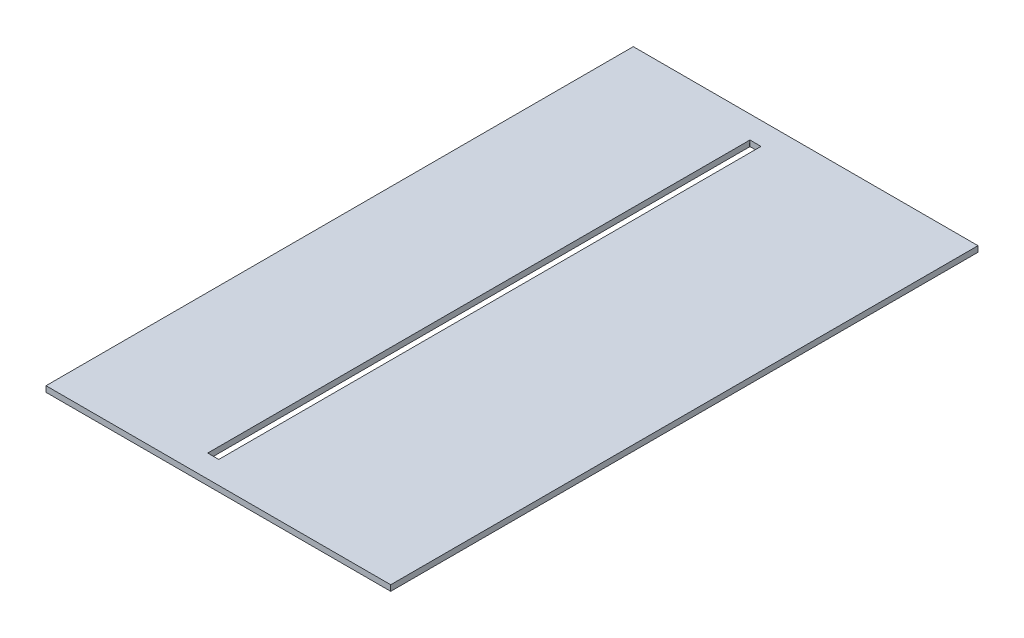
ISO-10303-21;
HEADER;
FILE_DESCRIPTION(('STEP AP214'),'2;1');
FILE_NAME('part.step','',(''),(''),'','','');
FILE_SCHEMA(('AUTOMOTIVE_DESIGN { 1 0 10303 214 1 1 1 1 }'));
ENDSEC;
DATA;
#1=APPLICATION_CONTEXT('core data for automotive mechanical design processes');
#2=APPLICATION_PROTOCOL_DEFINITION('international standard','automotive_design',2000,#1);
#3=PRODUCT_CONTEXT('',#1,'mechanical');
#4=PRODUCT('Part','Part','',(#3));
#5=PRODUCT_RELATED_PRODUCT_CATEGORY('part','',(#4));
#6=PRODUCT_DEFINITION_FORMATION('','',#4);
#7=PRODUCT_DEFINITION_CONTEXT('part definition',#1,'design');
#8=PRODUCT_DEFINITION('design','',#6,#7);
#9=PRODUCT_DEFINITION_SHAPE('','',#8);
#10=(LENGTH_UNIT() NAMED_UNIT(*) SI_UNIT(.MILLI.,.METRE.));
#11=(NAMED_UNIT(*) PLANE_ANGLE_UNIT() SI_UNIT($,.RADIAN.));
#12=(NAMED_UNIT(*) SI_UNIT($,.STERADIAN.) SOLID_ANGLE_UNIT());
#13=UNCERTAINTY_MEASURE_WITH_UNIT(LENGTH_MEASURE(1.E-05),#10,'distance_accuracy_value','');
#14=(GEOMETRIC_REPRESENTATION_CONTEXT(3) GLOBAL_UNCERTAINTY_ASSIGNED_CONTEXT((#13)) GLOBAL_UNIT_ASSIGNED_CONTEXT((#10,
#11,#12)) REPRESENTATION_CONTEXT('',''));
#15=CARTESIAN_POINT('',(0.,0.,0.));
#16=DIRECTION('',(0.,0.,1.));
#17=DIRECTION('',(1.,0.,0.));
#18=AXIS2_PLACEMENT_3D('',#15,#16,#17);
#19=CARTESIAN_POINT('',(18.6155805008028,19.8775376608099,62.7159322336888));
#20=DIRECTION('',(1.,0.,0.));
#21=DIRECTION('',(0.,1.,0.));
#22=AXIS2_PLACEMENT_3D('',#19,#20,#21);
#23=PLANE('',#22);
#24=DIRECTION('',(0.,0.,-1.));
#25=VECTOR('',#24,1.);
#26=CARTESIAN_POINT('',(18.6155805008028,20.499,62.7159322336888));
#27=LINE('',#26,#25);
#28=CARTESIAN_POINT('',(18.6155805008028,20.499,62.7159322336888));
#29=VERTEX_POINT('',#28);
#30=CARTESIAN_POINT('',(18.6155805008028,20.499,-0.715932233688751));
#31=VERTEX_POINT('',#30);
#32=EDGE_CURVE('E213',#29,#31,#27,.T.);
#33=ORIENTED_EDGE('',*,*,#32,.F.);
#34=DIRECTION('',(0.,1.,0.));
#35=VECTOR('',#34,1.);
#36=CARTESIAN_POINT('',(18.6155805008028,19.8775376608099,62.7159322336888));
#37=LINE('',#36,#35);
#38=CARTESIAN_POINT('',(18.6155805008028,19.8775376608099,62.7159322336888));
#39=VERTEX_POINT('',#38);
#40=EDGE_CURVE('E38',#39,#29,#37,.T.);
#41=ORIENTED_EDGE('',*,*,#40,.F.);
#42=DIRECTION('',(0.,0.,-1.));
#43=VECTOR('',#42,1.);
#44=CARTESIAN_POINT('',(18.6155805008028,19.8775376608099,62.7159322336888));
#45=LINE('',#44,#43);
#46=CARTESIAN_POINT('',(18.6155805008028,19.8775376608099,-0.715932233688751));
#47=VERTEX_POINT('',#46);
#48=EDGE_CURVE('E132',#39,#47,#45,.T.);
#49=ORIENTED_EDGE('',*,*,#48,.T.);
#50=DIRECTION('',(0.,1.,0.));
#51=VECTOR('',#50,1.);
#52=CARTESIAN_POINT('',(18.6155805008028,19.8775376608099,-0.715932233688751));
#53=LINE('',#52,#51);
#54=EDGE_CURVE('E10',#47,#31,#53,.T.);
#55=ORIENTED_EDGE('',*,*,#54,.T.);
#56=EDGE_LOOP('',(#33,#41,#49,#55));
#57=FACE_BOUND('',#56,.T.);
#58=ADVANCED_FACE('F16',(#57),#23,.T.);
#59=CARTESIAN_POINT('',(18.6155805008028,19.8775376608099,-0.715932233688748));
#60=DIRECTION('',(0.,0.,-1.));
#61=DIRECTION('',(-1.,0.,0.));
#62=AXIS2_PLACEMENT_3D('',#59,#60,#61);
#63=PLANE('',#62);
#64=DIRECTION('',(-1.,0.,0.));
#65=VECTOR('',#64,1.);
#66=CARTESIAN_POINT('',(18.6155805008028,20.499,-0.715932233688748));
#67=LINE('',#66,#65);
#68=CARTESIAN_POINT('',(-18.6155805008029,20.499,-0.715932233688765));
#69=VERTEX_POINT('',#68);
#70=EDGE_CURVE('E218',#31,#69,#67,.T.);
#71=ORIENTED_EDGE('',*,*,#70,.F.);
#72=ORIENTED_EDGE('',*,*,#54,.F.);
#73=DIRECTION('',(-1.,0.,0.));
#74=VECTOR('',#73,1.);
#75=CARTESIAN_POINT('',(18.6155805008028,19.8775376608099,-0.715932233688748));
#76=LINE('',#75,#74);
#77=CARTESIAN_POINT('',(-18.6155805008029,19.8775376608099,-0.715932233688765));
#78=VERTEX_POINT('',#77);
#79=EDGE_CURVE('E128',#47,#78,#76,.T.);
#80=ORIENTED_EDGE('',*,*,#79,.T.);
#81=DIRECTION('',(0.,1.,0.));
#82=VECTOR('',#81,1.);
#83=CARTESIAN_POINT('',(-18.6155805008029,19.8775376608099,-0.715932233688765));
#84=LINE('',#83,#82);
#85=EDGE_CURVE('E29',#78,#69,#84,.T.);
#86=ORIENTED_EDGE('',*,*,#85,.T.);
#87=EDGE_LOOP('',(#71,#72,#80,#86));
#88=FACE_BOUND('',#87,.T.);
#89=ADVANCED_FACE('F129',(#88),#63,.T.);
#90=CARTESIAN_POINT('',(-18.6155805008029,19.8775376608099,-0.715932233688765));
#91=DIRECTION('',(-1.,0.,0.));
#92=DIRECTION('',(0.,-1.,0.));
#93=AXIS2_PLACEMENT_3D('',#90,#91,#92);
#94=PLANE('',#93);
#95=DIRECTION('',(0.,0.,1.));
#96=VECTOR('',#95,1.);
#97=CARTESIAN_POINT('',(-18.6155805008029,20.499,-0.715932233688765));
#98=LINE('',#97,#96);
#99=CARTESIAN_POINT('',(-18.6155805008029,20.499,62.7159322336888));
#100=VERTEX_POINT('',#99);
#101=EDGE_CURVE('E122',#69,#100,#98,.T.);
#102=ORIENTED_EDGE('',*,*,#101,.F.);
#103=ORIENTED_EDGE('',*,*,#85,.F.);
#104=DIRECTION('',(0.,0.,1.));
#105=VECTOR('',#104,1.);
#106=CARTESIAN_POINT('',(-18.6155805008029,19.8775376608099,-0.715932233688765));
#107=LINE('',#106,#105);
#108=CARTESIAN_POINT('',(-18.6155805008029,19.8775376608099,62.7159322336888));
#109=VERTEX_POINT('',#108);
#110=EDGE_CURVE('E119',#78,#109,#107,.T.);
#111=ORIENTED_EDGE('',*,*,#110,.T.);
#112=DIRECTION('',(0.,1.,0.));
#113=VECTOR('',#112,1.);
#114=CARTESIAN_POINT('',(-18.6155805008029,19.8775376608099,62.7159322336888));
#115=LINE('',#114,#113);
#116=EDGE_CURVE('E78',#109,#100,#115,.T.);
#117=ORIENTED_EDGE('',*,*,#116,.T.);
#118=EDGE_LOOP('',(#102,#103,#111,#117));
#119=FACE_BOUND('',#118,.T.);
#120=ADVANCED_FACE('F117',(#119),#94,.T.);
#121=CARTESIAN_POINT('',(-2.43065265416086,19.8775376608099,1.71593223368875));
#122=CARTESIAN_POINT('',(-2.41272832618663,19.8775376608099,1.71615115131149));
#123=CARTESIAN_POINT('',(-2.39993946942402,19.8775376608099,1.72775921180229));
#124=CARTESIAN_POINT('',(-2.3890288597077,19.8775376608099,1.73766244396209));
#125=CARTESIAN_POINT('',(-2.38866730439238,19.8775376608099,1.74999999999999));
#126=B_SPLINE_CURVE_WITH_KNOTS('',2,(#121,#122,#123,#124,#125),.UNSPECIFIED.,.F.,.F.,(3,2,3),
(0.,0.5,1.),.UNSPECIFIED.);
#127=DIRECTION('',(0.,1.,0.));
#128=VECTOR('',#127,1.);
#129=SURFACE_OF_LINEAR_EXTRUSION('',#126,#128);
#130=CARTESIAN_POINT('',(-2.38866730439238,20.499,1.74999999999999));
#131=CARTESIAN_POINT('',(-2.3890288597077,20.499,1.73766244396209));
#132=CARTESIAN_POINT('',(-2.39993946942402,20.499,1.72775921180229));
#133=CARTESIAN_POINT('',(-2.41272832618663,20.499,1.71615115131149));
#134=CARTESIAN_POINT('',(-2.43065265416086,20.499,1.71593223368875));
#135=B_SPLINE_CURVE_WITH_KNOTS('',2,(#130,#131,#132,#133,#134),.UNSPECIFIED.,.F.,.F.,(3,2,3),
(0.,0.5,1.),.UNSPECIFIED.);
#136=CARTESIAN_POINT('',(-2.43065265416086,20.499,1.71593223368875));
#137=VERTEX_POINT('',#136);
#138=CARTESIAN_POINT('',(-2.38866730439237,20.499,1.75));
#139=VERTEX_POINT('',#138);
#140=EDGE_CURVE('E147',#137,#139,#135,.F.);
#141=ORIENTED_EDGE('',*,*,#140,.F.);
#142=CARTESIAN_POINT('',(-2.43065265416086,20.499,1.71593223368875));
#143=DIRECTION('',(0.,-1.,0.));
#144=VECTOR('',#143,1.);
#145=LINE('',#142,#144);
#146=CARTESIAN_POINT('',(-2.43065265416086,19.8775376608099,1.71593223368875));
#147=VERTEX_POINT('',#146);
#148=EDGE_CURVE('E137',#147,#137,#145,.F.);
#149=ORIENTED_EDGE('',*,*,#148,.F.);
#150=CARTESIAN_POINT('',(-2.43065265416086,19.8775376608099,1.71593223368875));
#151=CARTESIAN_POINT('',(-2.41272832618663,19.8775376608099,1.71615115131149));
#152=CARTESIAN_POINT('',(-2.39993946942402,19.8775376608099,1.72775921180229));
#153=CARTESIAN_POINT('',(-2.3890288597077,19.8775376608099,1.73766244396209));
#154=CARTESIAN_POINT('',(-2.38866730439238,19.8775376608099,1.74999999999999));
#155=B_SPLINE_CURVE_WITH_KNOTS('',2,(#150,#151,#152,#153,#154),.UNSPECIFIED.,.F.,.F.,(3,2,3),
(0.,0.5,1.),.UNSPECIFIED.);
#156=CARTESIAN_POINT('',(-2.38866730439237,19.8775376608099,1.75));
#157=VERTEX_POINT('',#156);
#158=EDGE_CURVE('E223',#147,#157,#155,.T.);
#159=ORIENTED_EDGE('',*,*,#158,.T.);
#160=CARTESIAN_POINT('',(-2.38866730439238,19.8775376608099,1.74999999999999));
#161=DIRECTION('',(0.,1.,0.));
#162=VECTOR('',#161,1.);
#163=LINE('',#160,#162);
#164=EDGE_CURVE('E89',#157,#139,#163,.T.);
#165=ORIENTED_EDGE('',*,*,#164,.T.);
#166=EDGE_LOOP('',(#141,#149,#159,#165));
#167=FACE_BOUND('',#166,.T.);
#168=ADVANCED_FACE('F18',(#167),#129,.T.);
#169=CARTESIAN_POINT('',(-2.38866730439237,19.8775376608099,1.75));
#170=DIRECTION('',(-1.,0.,0.));
#171=DIRECTION('',(0.,-1.,0.));
#172=AXIS2_PLACEMENT_3D('',#169,#170,#171);
#173=PLANE('',#172);
#174=DIRECTION('',(0.,0.,1.));
#175=VECTOR('',#174,1.);
#176=CARTESIAN_POINT('',(-2.38866730439237,20.499,1.75));
#177=LINE('',#176,#175);
#178=CARTESIAN_POINT('',(-2.38866730439238,20.499,60.25));
#179=VERTEX_POINT('',#178);
#180=EDGE_CURVE('E191',#139,#179,#177,.T.);
#181=ORIENTED_EDGE('',*,*,#180,.F.);
#182=ORIENTED_EDGE('',*,*,#164,.F.);
#183=DIRECTION('',(0.,0.,1.));
#184=VECTOR('',#183,1.);
#185=CARTESIAN_POINT('',(-2.38866730439237,19.8775376608099,1.75));
#186=LINE('',#185,#184);
#187=CARTESIAN_POINT('',(-2.38866730439238,19.8775376608099,60.25));
#188=VERTEX_POINT('',#187);
#189=EDGE_CURVE('E489',#157,#188,#186,.T.);
#190=ORIENTED_EDGE('',*,*,#189,.T.);
#191=CARTESIAN_POINT('',(-2.38866730439238,20.499,60.25));
#192=DIRECTION('',(0.,-1.,0.));
#193=VECTOR('',#192,1.);
#194=LINE('',#191,#193);
#195=EDGE_CURVE('E470',#188,#179,#194,.F.);
#196=ORIENTED_EDGE('',*,*,#195,.T.);
#197=EDGE_LOOP('',(#181,#182,#190,#196));
#198=FACE_BOUND('',#197,.T.);
#199=ADVANCED_FACE('F385',(#198),#173,.T.);
#200=CARTESIAN_POINT('',(-2.38866730439238,19.8775376608099,60.25));
#201=CARTESIAN_POINT('',(-2.38900687208195,19.8775376608099,60.2618331887794));
#202=CARTESIAN_POINT('',(-2.39986834425208,19.8775376608099,60.2722931359786));
#203=CARTESIAN_POINT('',(-2.41185994181735,19.8775376608099,60.2838414302983));
#204=CARTESIAN_POINT('',(-2.43065265416086,19.8775376608099,60.2840677663112));
#205=B_SPLINE_CURVE_WITH_KNOTS('',2,(#200,#201,#202,#203,#204),.UNSPECIFIED.,.F.,.F.,(3,2,3),
(0.,0.5,1.),.UNSPECIFIED.);
#206=DIRECTION('',(0.,1.,0.));
#207=VECTOR('',#206,1.);
#208=SURFACE_OF_LINEAR_EXTRUSION('',#205,#207);
#209=CARTESIAN_POINT('',(-2.43065265416086,20.499,60.2840677663112));
#210=CARTESIAN_POINT('',(-2.41185994181735,20.499,60.2838414302983));
#211=CARTESIAN_POINT('',(-2.39986834425208,20.499,60.2722931359786));
#212=CARTESIAN_POINT('',(-2.38900687208195,20.499,60.2618331887794));
#213=CARTESIAN_POINT('',(-2.38866730439238,20.499,60.25));
#214=B_SPLINE_CURVE_WITH_KNOTS('',2,(#209,#210,#211,#212,#213),.UNSPECIFIED.,.F.,.F.,(3,2,3),
(0.,0.5,1.),.UNSPECIFIED.);
#215=CARTESIAN_POINT('',(-2.43065265416086,20.499,60.2840677663112));
#216=VERTEX_POINT('',#215);
#217=EDGE_CURVE('E198',#179,#216,#214,.F.);
#218=ORIENTED_EDGE('',*,*,#217,.F.);
#219=ORIENTED_EDGE('',*,*,#195,.F.);
#220=CARTESIAN_POINT('',(-2.38866730439238,19.8775376608099,60.25));
#221=CARTESIAN_POINT('',(-2.38900687208195,19.8775376608099,60.2618331887794));
#222=CARTESIAN_POINT('',(-2.39986834425208,19.8775376608099,60.2722931359786));
#223=CARTESIAN_POINT('',(-2.41185994181735,19.8775376608099,60.2838414302983));
#224=CARTESIAN_POINT('',(-2.43065265416086,19.8775376608099,60.2840677663112));
#225=B_SPLINE_CURVE_WITH_KNOTS('',2,(#220,#221,#222,#223,#224),.UNSPECIFIED.,.F.,.F.,(3,2,3),
(0.,0.5,1.),.UNSPECIFIED.);
#226=CARTESIAN_POINT('',(-2.43065265416086,19.8775376608099,60.2840677663112));
#227=VERTEX_POINT('',#226);
#228=EDGE_CURVE('E487',#188,#227,#225,.T.);
#229=ORIENTED_EDGE('',*,*,#228,.T.);
#230=CARTESIAN_POINT('',(-2.43065265416086,19.8775376608099,60.2840677663112));
#231=DIRECTION('',(0.,1.,0.));
#232=VECTOR('',#231,1.);
#233=LINE('',#230,#232);
#234=EDGE_CURVE('E360',#227,#216,#233,.T.);
#235=ORIENTED_EDGE('',*,*,#234,.T.);
#236=EDGE_LOOP('',(#218,#219,#229,#235));
#237=FACE_BOUND('',#236,.T.);
#238=ADVANCED_FACE('F377',(#237),#208,.T.);
#239=CARTESIAN_POINT('',(-2.43065265416086,19.8775376608099,60.2840677663112));
#240=DIRECTION('',(0.,0.,-1.));
#241=DIRECTION('',(-1.,0.,0.));
#242=AXIS2_PLACEMENT_3D('',#239,#240,#241);
#243=PLANE('',#242);
#244=DIRECTION('',(-1.,0.,0.));
#245=VECTOR('',#244,1.);
#246=CARTESIAN_POINT('',(-2.43065265416086,20.499,60.2840677663112));
#247=LINE('',#246,#245);
#248=CARTESIAN_POINT('',(-3.54226510989813,20.499,60.2840677663112));
#249=VERTEX_POINT('',#248);
#250=EDGE_CURVE('E201',#216,#249,#247,.T.);
#251=ORIENTED_EDGE('',*,*,#250,.F.);
#252=ORIENTED_EDGE('',*,*,#234,.F.);
#253=DIRECTION('',(-1.,0.,0.));
#254=VECTOR('',#253,1.);
#255=CARTESIAN_POINT('',(-2.43065265416086,19.8775376608099,60.2840677663112));
#256=LINE('',#255,#254);
#257=CARTESIAN_POINT('',(-3.54226510989813,19.8775376608099,60.2840677663112));
#258=VERTEX_POINT('',#257);
#259=EDGE_CURVE('E494',#227,#258,#256,.T.);
#260=ORIENTED_EDGE('',*,*,#259,.T.);
#261=CARTESIAN_POINT('',(-3.54226510989813,20.499,60.2840677663112));
#262=DIRECTION('',(0.,-1.,0.));
#263=VECTOR('',#262,1.);
#264=LINE('',#261,#263);
#265=EDGE_CURVE('E342',#258,#249,#264,.F.);
#266=ORIENTED_EDGE('',*,*,#265,.T.);
#267=EDGE_LOOP('',(#251,#252,#260,#266));
#268=FACE_BOUND('',#267,.T.);
#269=ADVANCED_FACE('F319',(#268),#243,.T.);
#270=CARTESIAN_POINT('',(-3.54226510989813,19.8775376608099,60.2840677663112));
#271=CARTESIAN_POINT('',(-3.56018943787243,19.8775376608099,60.2838488486884));
#272=CARTESIAN_POINT('',(-3.57297829463497,19.8775376608099,60.2722407881977));
#273=CARTESIAN_POINT('',(-3.58388890435128,19.8775376608099,60.2623375560379));
#274=CARTESIAN_POINT('',(-3.58425045966661,19.8775376608099,60.25));
#275=B_SPLINE_CURVE_WITH_KNOTS('',2,(#270,#271,#272,#273,#274),.UNSPECIFIED.,.F.,.F.,(3,2,3),
(0.,0.5,1.),.UNSPECIFIED.);
#276=DIRECTION('',(0.,1.,0.));
#277=VECTOR('',#276,1.);
#278=SURFACE_OF_LINEAR_EXTRUSION('',#275,#277);
#279=CARTESIAN_POINT('',(-3.58425045966661,20.499,60.25));
#280=CARTESIAN_POINT('',(-3.58388890435128,20.499,60.2623375560379));
#281=CARTESIAN_POINT('',(-3.57297829463497,20.499,60.2722407881977));
#282=CARTESIAN_POINT('',(-3.56018943787243,20.499,60.2838488486884));
#283=CARTESIAN_POINT('',(-3.54226510989813,20.499,60.2840677663112));
#284=B_SPLINE_CURVE_WITH_KNOTS('',2,(#279,#280,#281,#282,#283),.UNSPECIFIED.,.F.,.F.,(3,2,3),
(0.,0.5,1.),.UNSPECIFIED.);
#285=CARTESIAN_POINT('',(-3.58425045966661,20.499,60.25));
#286=VERTEX_POINT('',#285);
#287=EDGE_CURVE('E204',#249,#286,#284,.F.);
#288=ORIENTED_EDGE('',*,*,#287,.F.);
#289=ORIENTED_EDGE('',*,*,#265,.F.);
#290=CARTESIAN_POINT('',(-3.54226510989813,19.8775376608099,60.2840677663112));
#291=CARTESIAN_POINT('',(-3.56018943787243,19.8775376608099,60.2838488486884));
#292=CARTESIAN_POINT('',(-3.57297829463497,19.8775376608099,60.2722407881977));
#293=CARTESIAN_POINT('',(-3.58388890435128,19.8775376608099,60.2623375560379));
#294=CARTESIAN_POINT('',(-3.58425045966661,19.8775376608099,60.25));
#295=B_SPLINE_CURVE_WITH_KNOTS('',2,(#290,#291,#292,#293,#294),.UNSPECIFIED.,.F.,.F.,(3,2,3),
(0.,0.5,1.),.UNSPECIFIED.);
#296=CARTESIAN_POINT('',(-3.58425045966661,19.8775376608099,60.25));
#297=VERTEX_POINT('',#296);
#298=EDGE_CURVE('E510',#258,#297,#295,.T.);
#299=ORIENTED_EDGE('',*,*,#298,.T.);
#300=CARTESIAN_POINT('',(-3.58425045966661,19.8775376608099,60.25));
#301=DIRECTION('',(0.,1.,0.));
#302=VECTOR('',#301,1.);
#303=LINE('',#300,#302);
#304=EDGE_CURVE('E293',#297,#286,#303,.T.);
#305=ORIENTED_EDGE('',*,*,#304,.T.);
#306=EDGE_LOOP('',(#288,#289,#299,#305));
#307=FACE_BOUND('',#306,.T.);
#308=ADVANCED_FACE('F310',(#307),#278,.T.);
#309=CARTESIAN_POINT('',(-3.58425045966661,19.8775376608099,60.25));
#310=DIRECTION('',(1.,0.,0.));
#311=DIRECTION('',(0.,1.,0.));
#312=AXIS2_PLACEMENT_3D('',#309,#310,#311);
#313=PLANE('',#312);
#314=DIRECTION('',(0.,0.,-1.));
#315=VECTOR('',#314,1.);
#316=CARTESIAN_POINT('',(-3.58425045966661,20.499,60.25));
#317=LINE('',#316,#315);
#318=CARTESIAN_POINT('',(-3.58425045966661,20.499,1.75));
#319=VERTEX_POINT('',#318);
#320=EDGE_CURVE('E207',#286,#319,#317,.T.);
#321=ORIENTED_EDGE('',*,*,#320,.F.);
#322=ORIENTED_EDGE('',*,*,#304,.F.);
#323=DIRECTION('',(0.,0.,-1.));
#324=VECTOR('',#323,1.);
#325=CARTESIAN_POINT('',(-3.58425045966661,19.8775376608099,60.25));
#326=LINE('',#325,#324);
#327=CARTESIAN_POINT('',(-3.58425045966661,19.8775376608099,1.75));
#328=VERTEX_POINT('',#327);
#329=EDGE_CURVE('E533',#297,#328,#326,.T.);
#330=ORIENTED_EDGE('',*,*,#329,.T.);
#331=CARTESIAN_POINT('',(-3.58425045966661,20.499,1.75));
#332=DIRECTION('',(0.,-1.,0.));
#333=VECTOR('',#332,1.);
#334=LINE('',#331,#333);
#335=EDGE_CURVE('E275',#328,#319,#334,.F.);
#336=ORIENTED_EDGE('',*,*,#335,.T.);
#337=EDGE_LOOP('',(#321,#322,#330,#336));
#338=FACE_BOUND('',#337,.T.);
#339=ADVANCED_FACE('F242',(#338),#313,.T.);
#340=CARTESIAN_POINT('',(-3.58425045966661,19.8775376608099,1.75));
#341=CARTESIAN_POINT('',(-3.58390679402451,19.8775376608099,1.7382729033761));
#342=CARTESIAN_POINT('',(-3.57297829463497,19.8775376608099,1.72775921180227));
#343=CARTESIAN_POINT('',(-3.56092154333398,19.8775376608099,1.71616009283429));
#344=CARTESIAN_POINT('',(-3.54226510989812,19.8775376608099,1.71593223368875));
#345=B_SPLINE_CURVE_WITH_KNOTS('',2,(#340,#341,#342,#343,#344),.UNSPECIFIED.,.F.,.F.,(3,2,3),
(0.,0.5,1.),.UNSPECIFIED.);
#346=DIRECTION('',(0.,1.,0.));
#347=VECTOR('',#346,1.);
#348=SURFACE_OF_LINEAR_EXTRUSION('',#345,#347);
#349=CARTESIAN_POINT('',(-3.54226510989812,20.499,1.71593223368875));
#350=CARTESIAN_POINT('',(-3.56092154333398,20.499,1.71616009283429));
#351=CARTESIAN_POINT('',(-3.57297829463497,20.499,1.72775921180227));
#352=CARTESIAN_POINT('',(-3.58390679402451,20.499,1.7382729033761));
#353=CARTESIAN_POINT('',(-3.58425045966661,20.499,1.75));
#354=B_SPLINE_CURVE_WITH_KNOTS('',2,(#349,#350,#351,#352,#353),.UNSPECIFIED.,.F.,.F.,(3,2,3),
(0.,0.5,1.),.UNSPECIFIED.);
#355=CARTESIAN_POINT('',(-3.54226510989813,20.499,1.71593223368875));
#356=VERTEX_POINT('',#355);
#357=EDGE_CURVE('E187',#319,#356,#354,.F.);
#358=ORIENTED_EDGE('',*,*,#357,.F.);
#359=ORIENTED_EDGE('',*,*,#335,.F.);
#360=CARTESIAN_POINT('',(-3.58425045966661,19.8775376608099,1.75));
#361=CARTESIAN_POINT('',(-3.58390679402451,19.8775376608099,1.7382729033761));
#362=CARTESIAN_POINT('',(-3.57297829463497,19.8775376608099,1.72775921180227));
#363=CARTESIAN_POINT('',(-3.56092154333398,19.8775376608099,1.71616009283429));
#364=CARTESIAN_POINT('',(-3.54226510989812,19.8775376608099,1.71593223368875));
#365=B_SPLINE_CURVE_WITH_KNOTS('',2,(#360,#361,#362,#363,#364),.UNSPECIFIED.,.F.,.F.,(3,2,3),
(0.,0.5,1.),.UNSPECIFIED.);
#366=CARTESIAN_POINT('',(-3.54226510989813,19.8775376608099,1.71593223368875));
#367=VERTEX_POINT('',#366);
#368=EDGE_CURVE('E418',#328,#367,#365,.T.);
#369=ORIENTED_EDGE('',*,*,#368,.T.);
#370=CARTESIAN_POINT('',(-3.54226510989812,19.8775376608099,1.71593223368875));
#371=DIRECTION('',(0.,1.,0.));
#372=VECTOR('',#371,1.);
#373=LINE('',#370,#372);
#374=EDGE_CURVE('E408',#367,#356,#373,.T.);
#375=ORIENTED_EDGE('',*,*,#374,.T.);
#376=EDGE_LOOP('',(#358,#359,#369,#375));
#377=FACE_BOUND('',#376,.T.);
#378=ADVANCED_FACE('F236',(#377),#348,.T.);
#379=CARTESIAN_POINT('',(-3.54226510989813,19.8775376608099,1.71593223368875));
#380=DIRECTION('',(0.,0.,1.));
#381=DIRECTION('',(1.,0.,0.));
#382=AXIS2_PLACEMENT_3D('',#379,#380,#381);
#383=PLANE('',#382);
#384=DIRECTION('',(1.,0.,0.));
#385=VECTOR('',#384,1.);
#386=CARTESIAN_POINT('',(-3.54226510989813,20.499,1.71593223368875));
#387=LINE('',#386,#385);
#388=EDGE_CURVE('E211',#356,#137,#387,.T.);
#389=ORIENTED_EDGE('',*,*,#388,.F.);
#390=ORIENTED_EDGE('',*,*,#374,.F.);
#391=DIRECTION('',(1.,0.,0.));
#392=VECTOR('',#391,1.);
#393=CARTESIAN_POINT('',(-3.54226510989813,19.8775376608099,1.71593223368875));
#394=LINE('',#393,#392);
#395=EDGE_CURVE('E537',#367,#147,#394,.T.);
#396=ORIENTED_EDGE('',*,*,#395,.T.);
#397=ORIENTED_EDGE('',*,*,#148,.T.);
#398=EDGE_LOOP('',(#389,#390,#396,#397));
#399=FACE_BOUND('',#398,.T.);
#400=ADVANCED_FACE('F241',(#399),#383,.T.);
#401=CARTESIAN_POINT('',(-18.6155805008029,19.8775376608099,62.7159322336888));
#402=DIRECTION('',(0.,0.,1.));
#403=DIRECTION('',(1.,0.,0.));
#404=AXIS2_PLACEMENT_3D('',#401,#402,#403);
#405=PLANE('',#404);
#406=DIRECTION('',(1.,0.,0.));
#407=VECTOR('',#406,1.);
#408=CARTESIAN_POINT('',(-18.6155805008029,20.499,62.7159322336888));
#409=LINE('',#408,#407);
#410=EDGE_CURVE('E221',#100,#29,#409,.T.);
#411=ORIENTED_EDGE('',*,*,#410,.F.);
#412=ORIENTED_EDGE('',*,*,#116,.F.);
#413=DIRECTION('',(1.,0.,0.));
#414=VECTOR('',#413,1.);
#415=CARTESIAN_POINT('',(-18.6155805008029,19.8775376608099,62.7159322336888));
#416=LINE('',#415,#414);
#417=EDGE_CURVE('E135',#109,#39,#416,.T.);
#418=ORIENTED_EDGE('',*,*,#417,.T.);
#419=ORIENTED_EDGE('',*,*,#40,.T.);
#420=EDGE_LOOP('',(#411,#412,#418,#419));
#421=FACE_BOUND('',#420,.T.);
#422=ADVANCED_FACE('F165',(#421),#405,.T.);
#423=CARTESIAN_POINT('',(17.9443584449264,19.8775376608099,31.));
#424=DIRECTION('',(0.,1.,0.));
#425=DIRECTION('',(-1.,0.,0.));
#426=AXIS2_PLACEMENT_3D('',#423,#424,#425);
#427=PLANE('',#426);
#428=ORIENTED_EDGE('',*,*,#158,.F.);
#429=ORIENTED_EDGE('',*,*,#395,.F.);
#430=ORIENTED_EDGE('',*,*,#368,.F.);
#431=ORIENTED_EDGE('',*,*,#329,.F.);
#432=ORIENTED_EDGE('',*,*,#298,.F.);
#433=ORIENTED_EDGE('',*,*,#259,.F.);
#434=ORIENTED_EDGE('',*,*,#228,.F.);
#435=ORIENTED_EDGE('',*,*,#189,.F.);
#436=EDGE_LOOP('',(#428,#429,#430,#431,#432,#433,#434,#435));
#437=FACE_BOUND('',#436,.T.);
#438=ORIENTED_EDGE('',*,*,#48,.F.);
#439=ORIENTED_EDGE('',*,*,#417,.F.);
#440=ORIENTED_EDGE('',*,*,#110,.F.);
#441=ORIENTED_EDGE('',*,*,#79,.F.);
#442=EDGE_LOOP('',(#438,#439,#440,#441));
#443=FACE_BOUND('',#442,.T.);
#444=ADVANCED_FACE('F134',(#437,#443),#427,.F.);
#445=CARTESIAN_POINT('',(17.9443584449264,20.499,31.));
#446=DIRECTION('',(0.,1.,0.));
#447=DIRECTION('',(-1.,0.,0.));
#448=AXIS2_PLACEMENT_3D('',#445,#446,#447);
#449=PLANE('',#448);
#450=ORIENTED_EDGE('',*,*,#140,.T.);
#451=ORIENTED_EDGE('',*,*,#180,.T.);
#452=ORIENTED_EDGE('',*,*,#217,.T.);
#453=ORIENTED_EDGE('',*,*,#250,.T.);
#454=ORIENTED_EDGE('',*,*,#287,.T.);
#455=ORIENTED_EDGE('',*,*,#320,.T.);
#456=ORIENTED_EDGE('',*,*,#357,.T.);
#457=ORIENTED_EDGE('',*,*,#388,.T.);
#458=EDGE_LOOP('',(#450,#451,#452,#453,#454,#455,#456,#457));
#459=FACE_BOUND('',#458,.T.);
#460=ORIENTED_EDGE('',*,*,#32,.T.);
#461=ORIENTED_EDGE('',*,*,#70,.T.);
#462=ORIENTED_EDGE('',*,*,#101,.T.);
#463=ORIENTED_EDGE('',*,*,#410,.T.);
#464=EDGE_LOOP('',(#460,#461,#462,#463));
#465=FACE_BOUND('',#464,.T.);
#466=ADVANCED_FACE('F154',(#459,#465),#449,.T.);
#467=CLOSED_SHELL('',(#58,#89,#120,#168,#199,#238,#269,#308,#339,#378,#400,#422,#444,#466));
#468=MANIFOLD_SOLID_BREP('B1',#467);
#469=ADVANCED_BREP_SHAPE_REPRESENTATION('',(#18,#468),#14);
#470=SHAPE_DEFINITION_REPRESENTATION(#9,#469);
ENDSEC;
END-ISO-10303-21;
